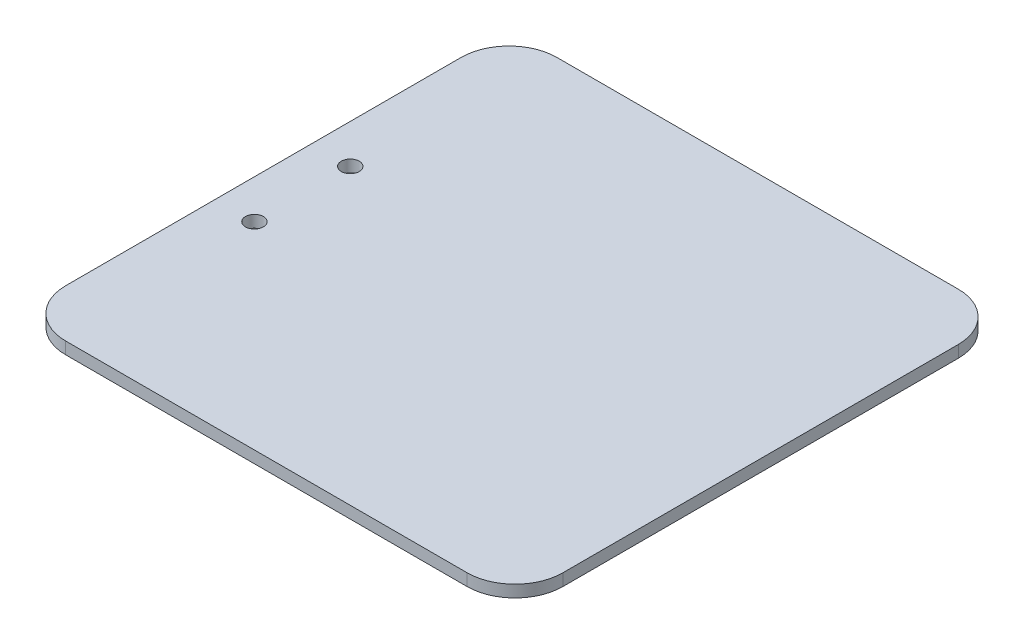
ISO-10303-21;
HEADER;
FILE_DESCRIPTION(('STEP AP214'),'2;1');
FILE_NAME('part.step','',(''),(''),'','','');
FILE_SCHEMA(('AUTOMOTIVE_DESIGN { 1 0 10303 214 1 1 1 1 }'));
ENDSEC;
DATA;
#1=APPLICATION_CONTEXT('core data for automotive mechanical design processes');
#2=APPLICATION_PROTOCOL_DEFINITION('international standard','automotive_design',2000,#1);
#3=PRODUCT_CONTEXT('',#1,'mechanical');
#4=PRODUCT('Part','Part','',(#3));
#5=PRODUCT_RELATED_PRODUCT_CATEGORY('part','',(#4));
#6=PRODUCT_DEFINITION_FORMATION('','',#4);
#7=PRODUCT_DEFINITION_CONTEXT('part definition',#1,'design');
#8=PRODUCT_DEFINITION('design','',#6,#7);
#9=PRODUCT_DEFINITION_SHAPE('','',#8);
#10=(LENGTH_UNIT() NAMED_UNIT(*) SI_UNIT(.MILLI.,.METRE.));
#11=(NAMED_UNIT(*) PLANE_ANGLE_UNIT() SI_UNIT($,.RADIAN.));
#12=(NAMED_UNIT(*) SI_UNIT($,.STERADIAN.) SOLID_ANGLE_UNIT());
#13=UNCERTAINTY_MEASURE_WITH_UNIT(LENGTH_MEASURE(1.E-05),#10,'distance_accuracy_value','');
#14=(GEOMETRIC_REPRESENTATION_CONTEXT(3) GLOBAL_UNCERTAINTY_ASSIGNED_CONTEXT((#13)) GLOBAL_UNIT_ASSIGNED_CONTEXT((#10,
#11,#12)) REPRESENTATION_CONTEXT('',''));
#15=CARTESIAN_POINT('',(0.,0.,0.));
#16=DIRECTION('',(0.,0.,1.));
#17=DIRECTION('',(1.,0.,0.));
#18=AXIS2_PLACEMENT_3D('',#15,#16,#17);
#19=CARTESIAN_POINT('',(8.,2.,-8.));
#20=DIRECTION('',(0.,-1.,0.));
#21=DIRECTION('',(0.,0.,-1.));
#22=AXIS2_PLACEMENT_3D('',#19,#20,#21);
#23=PLANE('',#22);
#24=CARTESIAN_POINT('',(8.,2.,-8.));
#25=DIRECTION('',(0.,1.,0.));
#26=DIRECTION('',(0.,0.,-1.));
#27=AXIS2_PLACEMENT_3D('',#24,#25,#26);
#28=CIRCLE('',#27,8.);
#29=CARTESIAN_POINT('',(0.,2.,-8.00000000000006));
#30=VERTEX_POINT('',#29);
#31=CARTESIAN_POINT('',(8.00000000000006,2.,0.));
#32=VERTEX_POINT('',#31);
#33=EDGE_CURVE('E170',#30,#32,#28,.T.);
#34=ORIENTED_EDGE('',*,*,#33,.T.);
#35=DIRECTION('',(1.,0.,0.));
#36=VECTOR('',#35,1.);
#37=CARTESIAN_POINT('',(8.00000000000006,2.,0.));
#38=LINE('',#37,#36);
#39=CARTESIAN_POINT('',(74.9999999999999,2.,0.));
#40=VERTEX_POINT('',#39);
#41=EDGE_CURVE('E106',#32,#40,#38,.T.);
#42=ORIENTED_EDGE('',*,*,#41,.T.);
#43=CARTESIAN_POINT('',(75.,2.,-8.));
#44=DIRECTION('',(0.,1.,0.));
#45=DIRECTION('',(0.,0.,1.));
#46=AXIS2_PLACEMENT_3D('',#43,#44,#45);
#47=CIRCLE('',#46,8.);
#48=CARTESIAN_POINT('',(83.,2.,-8.00000000000005));
#49=VERTEX_POINT('',#48);
#50=EDGE_CURVE('E191',#40,#49,#47,.T.);
#51=ORIENTED_EDGE('',*,*,#50,.T.);
#52=DIRECTION('',(0.,0.,-1.));
#53=VECTOR('',#52,1.);
#54=CARTESIAN_POINT('',(83.,2.,-8.00000000000006));
#55=LINE('',#54,#53);
#56=CARTESIAN_POINT('',(83.,2.,-73.9999999999999));
#57=VERTEX_POINT('',#56);
#58=EDGE_CURVE('E205',#49,#57,#55,.T.);
#59=ORIENTED_EDGE('',*,*,#58,.T.);
#60=CARTESIAN_POINT('',(75.,2.,-74.));
#61=DIRECTION('',(0.,1.,0.));
#62=DIRECTION('',(0.,0.,-1.));
#63=AXIS2_PLACEMENT_3D('',#60,#61,#62);
#64=CIRCLE('',#63,7.99999999999999);
#65=CARTESIAN_POINT('',(74.9999999999999,2.,-82.));
#66=VERTEX_POINT('',#65);
#67=EDGE_CURVE('E125',#57,#66,#64,.T.);
#68=ORIENTED_EDGE('',*,*,#67,.T.);
#69=DIRECTION('',(-1.,0.,0.));
#70=VECTOR('',#69,1.);
#71=CARTESIAN_POINT('',(8.00000000000006,2.,-82.));
#72=LINE('',#71,#70);
#73=CARTESIAN_POINT('',(8.00000000000006,2.,-82.));
#74=VERTEX_POINT('',#73);
#75=EDGE_CURVE('E119',#66,#74,#72,.T.);
#76=ORIENTED_EDGE('',*,*,#75,.T.);
#77=CARTESIAN_POINT('',(8.,2.,-74.));
#78=DIRECTION('',(0.,1.,0.));
#79=DIRECTION('',(0.,0.,-1.));
#80=AXIS2_PLACEMENT_3D('',#77,#78,#79);
#81=CIRCLE('',#80,8.);
#82=CARTESIAN_POINT('',(0.,2.,-73.9999999999999));
#83=VERTEX_POINT('',#82);
#84=EDGE_CURVE('E123',#74,#83,#81,.T.);
#85=ORIENTED_EDGE('',*,*,#84,.T.);
#86=DIRECTION('',(0.,0.,1.));
#87=VECTOR('',#86,1.);
#88=CARTESIAN_POINT('',(0.,2.,-8.00000000000006));
#89=LINE('',#88,#87);
#90=EDGE_CURVE('E63',#83,#30,#89,.T.);
#91=ORIENTED_EDGE('',*,*,#90,.T.);
#92=EDGE_LOOP('',(#34,#42,#51,#59,#68,#76,#85,#91));
#93=FACE_BOUND('',#92,.T.);
#94=CARTESIAN_POINT('',(6.5,2.,-49.));
#95=DIRECTION('',(0.,1.,0.));
#96=DIRECTION('',(0.,0.,1.));
#97=AXIS2_PLACEMENT_3D('',#94,#95,#96);
#98=CIRCLE('',#97,1.5);
#99=CARTESIAN_POINT('',(6.5,2.,-47.5));
#100=VERTEX_POINT('',#99);
#101=EDGE_CURVE('E152',#100,#100,#98,.T.);
#102=ORIENTED_EDGE('',*,*,#101,.F.);
#103=EDGE_LOOP('',(#102));
#104=FACE_BOUND('',#103,.T.);
#105=CARTESIAN_POINT('',(6.5,2.,-33.));
#106=DIRECTION('',(0.,1.,0.));
#107=DIRECTION('',(0.,0.,-1.));
#108=AXIS2_PLACEMENT_3D('',#105,#106,#107);
#109=CIRCLE('',#108,1.5);
#110=CARTESIAN_POINT('',(6.5,2.,-34.5));
#111=VERTEX_POINT('',#110);
#112=EDGE_CURVE('E219',#111,#111,#109,.T.);
#113=ORIENTED_EDGE('',*,*,#112,.F.);
#114=EDGE_LOOP('',(#113));
#115=FACE_BOUND('',#114,.T.);
#116=ADVANCED_FACE('F45',(#93,#104,#115),#23,.F.);
#117=CARTESIAN_POINT('',(8.,0.,-8.));
#118=DIRECTION('',(0.,-1.,0.));
#119=DIRECTION('',(0.,0.,-1.));
#120=AXIS2_PLACEMENT_3D('',#117,#118,#119);
#121=PLANE('',#120);
#122=CARTESIAN_POINT('',(6.5,0.,-49.));
#123=DIRECTION('',(0.,1.,0.));
#124=DIRECTION('',(0.,0.,1.));
#125=AXIS2_PLACEMENT_3D('',#122,#123,#124);
#126=CIRCLE('',#125,1.5);
#127=CARTESIAN_POINT('',(6.5,0.,-47.5));
#128=VERTEX_POINT('',#127);
#129=EDGE_CURVE('E215',#128,#128,#126,.T.);
#130=ORIENTED_EDGE('',*,*,#129,.T.);
#131=EDGE_LOOP('',(#130));
#132=FACE_BOUND('',#131,.T.);
#133=CARTESIAN_POINT('',(8.,0.,-8.));
#134=DIRECTION('',(0.,1.,0.));
#135=DIRECTION('',(0.,0.,-1.));
#136=AXIS2_PLACEMENT_3D('',#133,#134,#135);
#137=CIRCLE('',#136,8.);
#138=CARTESIAN_POINT('',(0.,0.,-8.00000000000006));
#139=VERTEX_POINT('',#138);
#140=CARTESIAN_POINT('',(8.00000000000006,0.,0.));
#141=VERTEX_POINT('',#140);
#142=EDGE_CURVE('E147',#139,#141,#137,.T.);
#143=ORIENTED_EDGE('',*,*,#142,.F.);
#144=DIRECTION('',(0.,0.,1.));
#145=VECTOR('',#144,1.);
#146=CARTESIAN_POINT('',(0.,0.,-8.00000000000006));
#147=LINE('',#146,#145);
#148=CARTESIAN_POINT('',(0.,0.,-73.9999999999999));
#149=VERTEX_POINT('',#148);
#150=EDGE_CURVE('E98',#149,#139,#147,.T.);
#151=ORIENTED_EDGE('',*,*,#150,.F.);
#152=CARTESIAN_POINT('',(8.,0.,-74.));
#153=DIRECTION('',(0.,1.,0.));
#154=DIRECTION('',(0.,0.,-1.));
#155=AXIS2_PLACEMENT_3D('',#152,#153,#154);
#156=CIRCLE('',#155,8.);
#157=CARTESIAN_POINT('',(8.00000000000006,0.,-82.));
#158=VERTEX_POINT('',#157);
#159=EDGE_CURVE('E92',#158,#149,#156,.T.);
#160=ORIENTED_EDGE('',*,*,#159,.F.);
#161=DIRECTION('',(-1.,0.,0.));
#162=VECTOR('',#161,1.);
#163=CARTESIAN_POINT('',(8.00000000000006,0.,-82.));
#164=LINE('',#163,#162);
#165=CARTESIAN_POINT('',(74.9999999999999,0.,-82.));
#166=VERTEX_POINT('',#165);
#167=EDGE_CURVE('E134',#166,#158,#164,.T.);
#168=ORIENTED_EDGE('',*,*,#167,.F.);
#169=CARTESIAN_POINT('',(75.,0.,-74.));
#170=DIRECTION('',(0.,1.,0.));
#171=DIRECTION('',(0.,0.,-1.));
#172=AXIS2_PLACEMENT_3D('',#169,#170,#171);
#173=CIRCLE('',#172,7.99999999999999);
#174=CARTESIAN_POINT('',(83.,0.,-73.9999999999999));
#175=VERTEX_POINT('',#174);
#176=EDGE_CURVE('E161',#175,#166,#173,.T.);
#177=ORIENTED_EDGE('',*,*,#176,.F.);
#178=DIRECTION('',(0.,0.,-1.));
#179=VECTOR('',#178,1.);
#180=CARTESIAN_POINT('',(83.,0.,-8.00000000000006));
#181=LINE('',#180,#179);
#182=CARTESIAN_POINT('',(83.,0.,-8.00000000000005));
#183=VERTEX_POINT('',#182);
#184=EDGE_CURVE('E158',#183,#175,#181,.T.);
#185=ORIENTED_EDGE('',*,*,#184,.F.);
#186=CARTESIAN_POINT('',(75.,0.,-8.));
#187=DIRECTION('',(0.,1.,0.));
#188=DIRECTION('',(0.,0.,1.));
#189=AXIS2_PLACEMENT_3D('',#186,#187,#188);
#190=CIRCLE('',#189,8.);
#191=CARTESIAN_POINT('',(74.9999999999999,0.,0.));
#192=VERTEX_POINT('',#191);
#193=EDGE_CURVE('E155',#192,#183,#190,.T.);
#194=ORIENTED_EDGE('',*,*,#193,.F.);
#195=DIRECTION('',(1.,0.,0.));
#196=VECTOR('',#195,1.);
#197=CARTESIAN_POINT('',(8.00000000000006,0.,0.));
#198=LINE('',#197,#196);
#199=EDGE_CURVE('E151',#141,#192,#198,.T.);
#200=ORIENTED_EDGE('',*,*,#199,.F.);
#201=EDGE_LOOP('',(#143,#151,#160,#168,#177,#185,#194,#200));
#202=FACE_BOUND('',#201,.T.);
#203=CARTESIAN_POINT('',(6.5,0.,-33.));
#204=DIRECTION('',(0.,1.,0.));
#205=DIRECTION('',(0.,0.,-1.));
#206=AXIS2_PLACEMENT_3D('',#203,#204,#205);
#207=CIRCLE('',#206,1.5);
#208=CARTESIAN_POINT('',(6.5,0.,-34.5));
#209=VERTEX_POINT('',#208);
#210=EDGE_CURVE('E223',#209,#209,#207,.T.);
#211=ORIENTED_EDGE('',*,*,#210,.T.);
#212=EDGE_LOOP('',(#211));
#213=FACE_BOUND('',#212,.T.);
#214=ADVANCED_FACE('F195',(#132,#202,#213),#121,.T.);
#215=CARTESIAN_POINT('',(8.,2.,-8.));
#216=DIRECTION('',(0.,-1.,0.));
#217=DIRECTION('',(0.,0.,-1.));
#218=AXIS2_PLACEMENT_3D('',#215,#216,#217);
#219=CYLINDRICAL_SURFACE('',#218,8.);
#220=ORIENTED_EDGE('',*,*,#142,.T.);
#221=DIRECTION('',(0.,-1.,0.));
#222=VECTOR('',#221,1.);
#223=CARTESIAN_POINT('',(8.00000000000006,2.,0.));
#224=LINE('',#223,#222);
#225=EDGE_CURVE('E11',#32,#141,#224,.T.);
#226=ORIENTED_EDGE('',*,*,#225,.F.);
#227=ORIENTED_EDGE('',*,*,#33,.F.);
#228=DIRECTION('',(0.,-1.,0.));
#229=VECTOR('',#228,1.);
#230=CARTESIAN_POINT('',(0.,2.,-8.00000000000006));
#231=LINE('',#230,#229);
#232=EDGE_CURVE('E143',#30,#139,#231,.T.);
#233=ORIENTED_EDGE('',*,*,#232,.T.);
#234=EDGE_LOOP('',(#220,#226,#227,#233));
#235=FACE_BOUND('',#234,.T.);
#236=ADVANCED_FACE('F47',(#235),#219,.T.);
#237=CARTESIAN_POINT('',(8.00000000000006,2.,0.));
#238=DIRECTION('',(0.,0.,-1.));
#239=DIRECTION('',(-1.,0.,0.));
#240=AXIS2_PLACEMENT_3D('',#237,#238,#239);
#241=PLANE('',#240);
#242=ORIENTED_EDGE('',*,*,#199,.T.);
#243=DIRECTION('',(0.,-1.,0.));
#244=VECTOR('',#243,1.);
#245=CARTESIAN_POINT('',(74.9999999999999,2.,0.));
#246=LINE('',#245,#244);
#247=EDGE_CURVE('E55',#40,#192,#246,.T.);
#248=ORIENTED_EDGE('',*,*,#247,.F.);
#249=ORIENTED_EDGE('',*,*,#41,.F.);
#250=ORIENTED_EDGE('',*,*,#225,.T.);
#251=EDGE_LOOP('',(#242,#248,#249,#250));
#252=FACE_BOUND('',#251,.T.);
#253=ADVANCED_FACE('F257',(#252),#241,.F.);
#254=CARTESIAN_POINT('',(75.,2.,-8.));
#255=DIRECTION('',(0.,-1.,0.));
#256=DIRECTION('',(0.,0.,-1.));
#257=AXIS2_PLACEMENT_3D('',#254,#255,#256);
#258=CYLINDRICAL_SURFACE('',#257,8.);
#259=ORIENTED_EDGE('',*,*,#193,.T.);
#260=DIRECTION('',(0.,-1.,0.));
#261=VECTOR('',#260,1.);
#262=CARTESIAN_POINT('',(83.,2.,-8.00000000000005));
#263=LINE('',#262,#261);
#264=EDGE_CURVE('E181',#49,#183,#263,.T.);
#265=ORIENTED_EDGE('',*,*,#264,.F.);
#266=ORIENTED_EDGE('',*,*,#50,.F.);
#267=ORIENTED_EDGE('',*,*,#247,.T.);
#268=EDGE_LOOP('',(#259,#265,#266,#267));
#269=FACE_BOUND('',#268,.T.);
#270=ADVANCED_FACE('F189',(#269),#258,.T.);
#271=CARTESIAN_POINT('',(83.,2.,-8.00000000000006));
#272=DIRECTION('',(-1.,0.,0.));
#273=DIRECTION('',(0.,0.,1.));
#274=AXIS2_PLACEMENT_3D('',#271,#272,#273);
#275=PLANE('',#274);
#276=ORIENTED_EDGE('',*,*,#184,.T.);
#277=DIRECTION('',(0.,-1.,0.));
#278=VECTOR('',#277,1.);
#279=CARTESIAN_POINT('',(83.,2.,-73.9999999999999));
#280=LINE('',#279,#278);
#281=EDGE_CURVE('E177',#57,#175,#280,.T.);
#282=ORIENTED_EDGE('',*,*,#281,.F.);
#283=ORIENTED_EDGE('',*,*,#58,.F.);
#284=ORIENTED_EDGE('',*,*,#264,.T.);
#285=EDGE_LOOP('',(#276,#282,#283,#284));
#286=FACE_BOUND('',#285,.T.);
#287=ADVANCED_FACE('F200',(#286),#275,.F.);
#288=CARTESIAN_POINT('',(75.,2.,-74.));
#289=DIRECTION('',(0.,-1.,0.));
#290=DIRECTION('',(0.,0.,-1.));
#291=AXIS2_PLACEMENT_3D('',#288,#289,#290);
#292=CYLINDRICAL_SURFACE('',#291,7.99999999999999);
#293=ORIENTED_EDGE('',*,*,#176,.T.);
#294=DIRECTION('',(0.,-1.,0.));
#295=VECTOR('',#294,1.);
#296=CARTESIAN_POINT('',(74.9999999999999,2.,-82.));
#297=LINE('',#296,#295);
#298=EDGE_CURVE('E136',#66,#166,#297,.T.);
#299=ORIENTED_EDGE('',*,*,#298,.F.);
#300=ORIENTED_EDGE('',*,*,#67,.F.);
#301=ORIENTED_EDGE('',*,*,#281,.T.);
#302=EDGE_LOOP('',(#293,#299,#300,#301));
#303=FACE_BOUND('',#302,.T.);
#304=ADVANCED_FACE('F203',(#303),#292,.T.);
#305=CARTESIAN_POINT('',(8.00000000000006,2.,-82.));
#306=DIRECTION('',(0.,0.,1.));
#307=DIRECTION('',(1.,0.,0.));
#308=AXIS2_PLACEMENT_3D('',#305,#306,#307);
#309=PLANE('',#308);
#310=ORIENTED_EDGE('',*,*,#167,.T.);
#311=DIRECTION('',(0.,-1.,0.));
#312=VECTOR('',#311,1.);
#313=CARTESIAN_POINT('',(8.00000000000006,2.,-82.));
#314=LINE('',#313,#312);
#315=EDGE_CURVE('E131',#74,#158,#314,.T.);
#316=ORIENTED_EDGE('',*,*,#315,.F.);
#317=ORIENTED_EDGE('',*,*,#75,.F.);
#318=ORIENTED_EDGE('',*,*,#298,.T.);
#319=EDGE_LOOP('',(#310,#316,#317,#318));
#320=FACE_BOUND('',#319,.T.);
#321=ADVANCED_FACE('F132',(#320),#309,.F.);
#322=CARTESIAN_POINT('',(8.,2.,-74.));
#323=DIRECTION('',(0.,-1.,0.));
#324=DIRECTION('',(0.,0.,-1.));
#325=AXIS2_PLACEMENT_3D('',#322,#323,#324);
#326=CYLINDRICAL_SURFACE('',#325,8.);
#327=ORIENTED_EDGE('',*,*,#159,.T.);
#328=DIRECTION('',(0.,-1.,0.));
#329=VECTOR('',#328,1.);
#330=CARTESIAN_POINT('',(0.,2.,-73.9999999999999));
#331=LINE('',#330,#329);
#332=EDGE_CURVE('E137',#83,#149,#331,.T.);
#333=ORIENTED_EDGE('',*,*,#332,.F.);
#334=ORIENTED_EDGE('',*,*,#84,.F.);
#335=ORIENTED_EDGE('',*,*,#315,.T.);
#336=EDGE_LOOP('',(#327,#333,#334,#335));
#337=FACE_BOUND('',#336,.T.);
#338=ADVANCED_FACE('F139',(#337),#326,.T.);
#339=CARTESIAN_POINT('',(0.,2.,-8.00000000000006));
#340=DIRECTION('',(1.,0.,0.));
#341=DIRECTION('',(0.,0.,-1.));
#342=AXIS2_PLACEMENT_3D('',#339,#340,#341);
#343=PLANE('',#342);
#344=ORIENTED_EDGE('',*,*,#150,.T.);
#345=ORIENTED_EDGE('',*,*,#232,.F.);
#346=ORIENTED_EDGE('',*,*,#90,.F.);
#347=ORIENTED_EDGE('',*,*,#332,.T.);
#348=EDGE_LOOP('',(#344,#345,#346,#347));
#349=FACE_BOUND('',#348,.T.);
#350=ADVANCED_FACE('F245',(#349),#343,.F.);
#351=CARTESIAN_POINT('',(6.5,2.,-49.));
#352=DIRECTION('',(0.,-1.,0.));
#353=DIRECTION('',(0.,0.,-1.));
#354=AXIS2_PLACEMENT_3D('',#351,#352,#353);
#355=CYLINDRICAL_SURFACE('',#354,1.5);
#356=ORIENTED_EDGE('',*,*,#101,.T.);
#357=EDGE_LOOP('',(#356));
#358=FACE_BOUND('',#357,.T.);
#359=ORIENTED_EDGE('',*,*,#129,.F.);
#360=EDGE_LOOP('',(#359));
#361=FACE_BOUND('',#360,.T.);
#362=ADVANCED_FACE('F242',(#358,#361),#355,.F.);
#363=CARTESIAN_POINT('',(6.5,2.,-33.));
#364=DIRECTION('',(0.,-1.,0.));
#365=DIRECTION('',(0.,0.,-1.));
#366=AXIS2_PLACEMENT_3D('',#363,#364,#365);
#367=CYLINDRICAL_SURFACE('',#366,1.5);
#368=ORIENTED_EDGE('',*,*,#112,.T.);
#369=EDGE_LOOP('',(#368));
#370=FACE_BOUND('',#369,.T.);
#371=ORIENTED_EDGE('',*,*,#210,.F.);
#372=EDGE_LOOP('',(#371));
#373=FACE_BOUND('',#372,.T.);
#374=ADVANCED_FACE('F231',(#370,#373),#367,.F.);
#375=CLOSED_SHELL('',(#116,#214,#236,#253,#270,#287,#304,#321,#338,#350,#362,#374));
#376=MANIFOLD_SOLID_BREP('B2',#375);
#377=ADVANCED_BREP_SHAPE_REPRESENTATION('',(#18,#376),#14);
#378=SHAPE_DEFINITION_REPRESENTATION(#9,#377);
ENDSEC;
END-ISO-10303-21;
